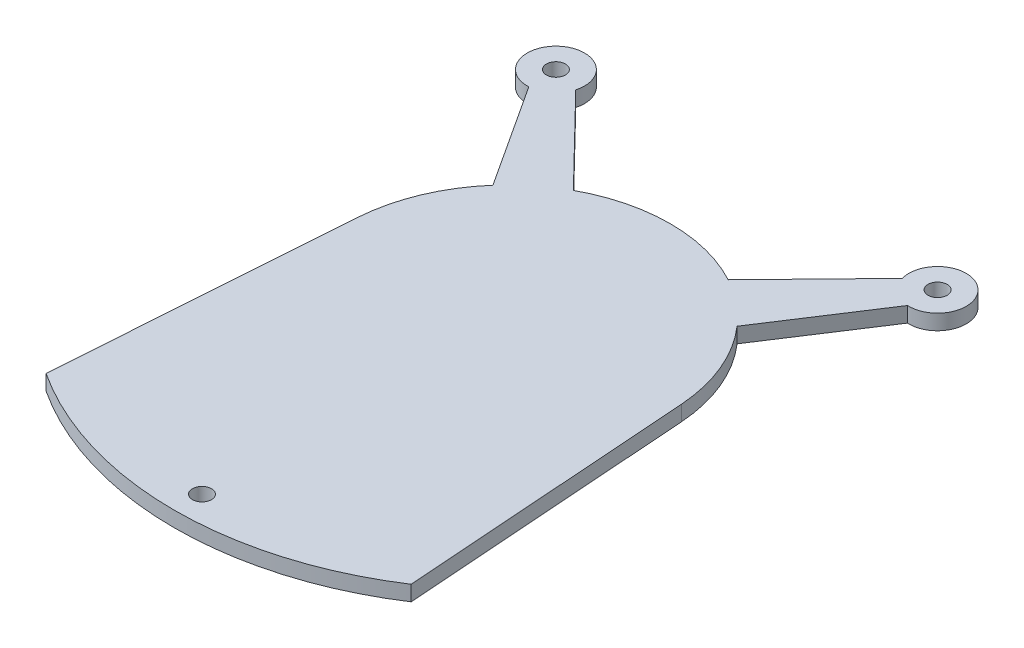
ISO-10303-21;
HEADER;
FILE_DESCRIPTION(('STEP AP214'),'2;1');
FILE_NAME('part.step','',(''),(''),'','','');
FILE_SCHEMA(('AUTOMOTIVE_DESIGN { 1 0 10303 214 1 1 1 1 }'));
ENDSEC;
DATA;
#1=APPLICATION_CONTEXT('core data for automotive mechanical design processes');
#2=APPLICATION_PROTOCOL_DEFINITION('international standard','automotive_design',2000,#1);
#3=PRODUCT_CONTEXT('',#1,'mechanical');
#4=PRODUCT('Part','Part','',(#3));
#5=PRODUCT_RELATED_PRODUCT_CATEGORY('part','',(#4));
#6=PRODUCT_DEFINITION_FORMATION('','',#4);
#7=PRODUCT_DEFINITION_CONTEXT('part definition',#1,'design');
#8=PRODUCT_DEFINITION('design','',#6,#7);
#9=PRODUCT_DEFINITION_SHAPE('','',#8);
#10=(LENGTH_UNIT() NAMED_UNIT(*) SI_UNIT(.MILLI.,.METRE.));
#11=(NAMED_UNIT(*) PLANE_ANGLE_UNIT() SI_UNIT($,.RADIAN.));
#12=(NAMED_UNIT(*) SI_UNIT($,.STERADIAN.) SOLID_ANGLE_UNIT());
#13=UNCERTAINTY_MEASURE_WITH_UNIT(LENGTH_MEASURE(1.E-05),#10,'distance_accuracy_value','');
#14=(GEOMETRIC_REPRESENTATION_CONTEXT(3) GLOBAL_UNCERTAINTY_ASSIGNED_CONTEXT((#13)) GLOBAL_UNIT_ASSIGNED_CONTEXT((#10,
#11,#12)) REPRESENTATION_CONTEXT('',''));
#15=CARTESIAN_POINT('',(0.,0.,0.));
#16=DIRECTION('',(0.,0.,1.));
#17=DIRECTION('',(1.,0.,0.));
#18=AXIS2_PLACEMENT_3D('',#15,#16,#17);
#19=CARTESIAN_POINT('',(-28.9,47.2,0.));
#20=DIRECTION('',(0.,1.,0.));
#21=DIRECTION('',(0.,0.,1.));
#22=AXIS2_PLACEMENT_3D('',#19,#20,#21);
#23=PLANE('',#22);
#24=CARTESIAN_POINT('',(2.6645352591E-13,47.2,32.09321722645));
#25=DIRECTION('',(0.,1.,0.));
#26=DIRECTION('',(0.,0.,1.));
#27=AXIS2_PLACEMENT_3D('',#24,#25,#26);
#28=CIRCLE('',#27,1.);
#29=CARTESIAN_POINT('',(2.6645352591E-13,47.2,33.09321722645));
#30=VERTEX_POINT('',#29);
#31=EDGE_CURVE('E172',#30,#30,#28,.F.);
#32=ORIENTED_EDGE('',*,*,#31,.T.);
#33=EDGE_LOOP('',(#32));
#34=FACE_BOUND('',#33,.T.);
#35=CARTESIAN_POINT('',(20.,47.2,-25.));
#36=DIRECTION('',(0.,1.,0.));
#37=DIRECTION('',(0.,0.,1.));
#38=AXIS2_PLACEMENT_3D('',#35,#36,#37);
#39=CIRCLE('',#38,1.);
#40=CARTESIAN_POINT('',(20.,47.2,-24.));
#41=VERTEX_POINT('',#40);
#42=EDGE_CURVE('E175',#41,#41,#39,.F.);
#43=ORIENTED_EDGE('',*,*,#42,.T.);
#44=EDGE_LOOP('',(#43));
#45=FACE_BOUND('',#44,.T.);
#46=CARTESIAN_POINT('',(-20.,47.2,-25.));
#47=DIRECTION('',(0.,1.,0.));
#48=DIRECTION('',(0.,0.,1.));
#49=AXIS2_PLACEMENT_3D('',#46,#47,#48);
#50=CIRCLE('',#49,1.);
#51=CARTESIAN_POINT('',(-20.,47.2,-24.));
#52=VERTEX_POINT('',#51);
#53=EDGE_CURVE('E178',#52,#52,#50,.F.);
#54=ORIENTED_EDGE('',*,*,#53,.T.);
#55=EDGE_LOOP('',(#54));
#56=FACE_BOUND('',#55,.T.);
#57=DIRECTION('',(-0.0711911611478,0.,0.997462690317));
#58=VECTOR('',#57,1.);
#59=CARTESIAN_POINT('',(-16.95686573539,47.2,-1.210249739513));
#60=LINE('',#59,#58);
#61=CARTESIAN_POINT('',(-19.1348964547178,47.2,29.3062405925299));
#62=VERTEX_POINT('',#61);
#63=CARTESIAN_POINT('',(-16.9568657353902,47.2,-1.21024973951075));
#64=VERTEX_POINT('',#63);
#65=EDGE_CURVE('E116',#62,#64,#60,.F.);
#66=ORIENTED_EDGE('',*,*,#65,.F.);
#67=CARTESIAN_POINT('',(2.6645352591E-13,47.2,2.060573933704E-13));
#68=DIRECTION('',(0.,1.,0.));
#69=DIRECTION('',(0.,0.,1.));
#70=AXIS2_PLACEMENT_3D('',#67,#68,#69);
#71=CIRCLE('',#70,35.);
#72=CARTESIAN_POINT('',(19.1348964547199,47.2,29.3062405925293));
#73=VERTEX_POINT('',#72);
#74=EDGE_CURVE('E19',#73,#62,#71,.F.);
#75=ORIENTED_EDGE('',*,*,#74,.F.);
#76=DIRECTION('',(-0.0711911611478,0.,-0.997462690317));
#77=VECTOR('',#76,1.);
#78=CARTESIAN_POINT('',(19.13489645472,47.2,29.30624059253));
#79=LINE('',#78,#77);
#80=CARTESIAN_POINT('',(16.9568657353907,47.2,-1.21024973951327));
#81=VERTEX_POINT('',#80);
#82=EDGE_CURVE('E102',#81,#73,#79,.F.);
#83=ORIENTED_EDGE('',*,*,#82,.F.);
#84=CARTESIAN_POINT('',(2.6645352591E-13,47.2,2.060573933704E-13));
#85=DIRECTION('',(0.,1.,0.));
#86=DIRECTION('',(0.,0.,1.));
#87=AXIS2_PLACEMENT_3D('',#84,#85,#86);
#88=CIRCLE('',#87,17.);
#89=CARTESIAN_POINT('',(12.7957539295805,47.2,-11.1923492339007));
#90=VERTEX_POINT('',#89);
#91=EDGE_CURVE('E123',#90,#81,#88,.F.);
#92=ORIENTED_EDGE('',*,*,#91,.F.);
#93=DIRECTION('',(0.546130195540326,0.,-0.83770031008654));
#94=VECTOR('',#93,1.);
#95=CARTESIAN_POINT('',(12.79575392958,47.2,-11.1923492339));
#96=LINE('',#95,#94);
#97=CARTESIAN_POINT('',(19.8443268773409,47.2,-22.0040417428006));
#98=VERTEX_POINT('',#97);
#99=EDGE_CURVE('E142',#98,#90,#96,.F.);
#100=ORIENTED_EDGE('',*,*,#99,.F.);
#101=CARTESIAN_POINT('',(20.,47.2,-25.));
#102=DIRECTION('',(0.,1.,0.));
#103=DIRECTION('',(0.,0.,1.));
#104=AXIS2_PLACEMENT_3D('',#101,#102,#103);
#105=CIRCLE('',#104,3.);
#106=CARTESIAN_POINT('',(17.1112860442906,47.2,-24.1904744092406));
#107=VERTEX_POINT('',#106);
#108=EDGE_CURVE('E188',#107,#98,#105,.F.);
#109=ORIENTED_EDGE('',*,*,#108,.F.);
#110=DIRECTION('',(-0.697386357160894,0.,0.716695380790094));
#111=VECTOR('',#110,1.);
#112=CARTESIAN_POINT('',(17.11128604429,47.2,-24.19047440924));
#113=LINE('',#112,#111);
#114=CARTESIAN_POINT('',(8.11054107292263,47.2,-14.940519519228));
#115=VERTEX_POINT('',#114);
#116=EDGE_CURVE('E138',#115,#107,#113,.F.);
#117=ORIENTED_EDGE('',*,*,#116,.F.);
#118=CARTESIAN_POINT('',(2.6645352591E-13,47.2,2.060573933704E-13));
#119=DIRECTION('',(0.,1.,0.));
#120=DIRECTION('',(0.,0.,1.));
#121=AXIS2_PLACEMENT_3D('',#118,#119,#120);
#122=CIRCLE('',#121,17.);
#123=CARTESIAN_POINT('',(-8.11054107292197,47.2,-14.9405195192289));
#124=VERTEX_POINT('',#123);
#125=EDGE_CURVE('E186',#124,#115,#122,.F.);
#126=ORIENTED_EDGE('',*,*,#125,.F.);
#127=DIRECTION('',(-0.697386357160894,0.,-0.716695380790094));
#128=VECTOR('',#127,1.);
#129=CARTESIAN_POINT('',(-8.110541072923,47.2,-14.94051951923));
#130=LINE('',#129,#128);
#131=CARTESIAN_POINT('',(-17.1112860442911,47.2,-24.1904744092418));
#132=VERTEX_POINT('',#131);
#133=EDGE_CURVE('E134',#132,#124,#130,.F.);
#134=ORIENTED_EDGE('',*,*,#133,.F.);
#135=CARTESIAN_POINT('',(-20.,47.2,-25.));
#136=DIRECTION('',(0.,1.,0.));
#137=DIRECTION('',(0.,0.,1.));
#138=AXIS2_PLACEMENT_3D('',#135,#136,#137);
#139=CIRCLE('',#138,3.);
#140=CARTESIAN_POINT('',(-19.8443268773402,47.2,-22.0040417428003));
#141=VERTEX_POINT('',#140);
#142=EDGE_CURVE('E184',#141,#132,#139,.F.);
#143=ORIENTED_EDGE('',*,*,#142,.F.);
#144=DIRECTION('',(0.546130195540326,0.,0.83770031008654));
#145=VECTOR('',#144,1.);
#146=CARTESIAN_POINT('',(-19.84432687734,47.2,-22.0040417428));
#147=LINE('',#146,#145);
#148=CARTESIAN_POINT('',(-12.7957539295804,47.2,-11.1923492339015));
#149=VERTEX_POINT('',#148);
#150=EDGE_CURVE('E130',#149,#141,#147,.F.);
#151=ORIENTED_EDGE('',*,*,#150,.F.);
#152=CARTESIAN_POINT('',(2.6645352591E-13,47.2,2.060573933704E-13));
#153=DIRECTION('',(0.,1.,0.));
#154=DIRECTION('',(0.,0.,1.));
#155=AXIS2_PLACEMENT_3D('',#152,#153,#154);
#156=CIRCLE('',#155,17.);
#157=EDGE_CURVE('E181',#64,#149,#156,.F.);
#158=ORIENTED_EDGE('',*,*,#157,.F.);
#159=EDGE_LOOP('',(#66,#75,#83,#92,#100,#109,#117,#126,#134,#143,#151,#158));
#160=FACE_BOUND('',#159,.T.);
#161=ADVANCED_FACE('F15',(#34,#45,#56,#160),#23,.T.);
#162=CARTESIAN_POINT('',(2.6645352591E-13,45.6,2.060573933704E-13));
#163=DIRECTION('',(0.,1.,0.));
#164=DIRECTION('',(0.,0.,1.));
#165=AXIS2_PLACEMENT_3D('',#162,#163,#164);
#166=CYLINDRICAL_SURFACE('',#165,35.);
#167=DIRECTION('',(0.,1.,0.));
#168=VECTOR('',#167,1.);
#169=CARTESIAN_POINT('',(-19.1348964547178,45.6,29.3062405925302));
#170=LINE('',#169,#168);
#171=CARTESIAN_POINT('',(-19.1348964547188,45.6,29.3062405925292));
#172=VERTEX_POINT('',#171);
#173=EDGE_CURVE('E129',#172,#62,#170,.T.);
#174=ORIENTED_EDGE('',*,*,#173,.F.);
#175=CARTESIAN_POINT('',(2.6645352591E-13,45.6,2.060573933704E-13));
#176=DIRECTION('',(0.,1.,0.));
#177=DIRECTION('',(0.,0.,1.));
#178=AXIS2_PLACEMENT_3D('',#175,#176,#177);
#179=CIRCLE('',#178,35.);
#180=CARTESIAN_POINT('',(19.1348964547199,45.6,29.3062405925293));
#181=VERTEX_POINT('',#180);
#182=EDGE_CURVE('E122',#172,#181,#179,.T.);
#183=ORIENTED_EDGE('',*,*,#182,.T.);
#184=DIRECTION('',(0.,1.,0.));
#185=VECTOR('',#184,1.);
#186=CARTESIAN_POINT('',(19.13489645472,45.6,29.30624059253));
#187=LINE('',#186,#185);
#188=EDGE_CURVE('E107',#73,#181,#187,.F.);
#189=ORIENTED_EDGE('',*,*,#188,.F.);
#190=ORIENTED_EDGE('',*,*,#74,.T.);
#191=EDGE_LOOP('',(#174,#183,#189,#190));
#192=FACE_BOUND('',#191,.T.);
#193=ADVANCED_FACE('F121',(#192),#166,.T.);
#194=CARTESIAN_POINT('',(19.13489645472,45.6,29.30624059253));
#195=DIRECTION('',(0.997462690317,0.,-0.0711911611478));
#196=DIRECTION('',(-0.0711911611478,0.,-0.997462690317));
#197=AXIS2_PLACEMENT_3D('',#194,#195,#196);
#198=PLANE('',#197);
#199=ORIENTED_EDGE('',*,*,#188,.T.);
#200=DIRECTION('',(-0.0711911611478701,0.,-0.997462690316995));
#201=VECTOR('',#200,1.);
#202=CARTESIAN_POINT('',(19.13489645472,45.6,29.30624059253));
#203=LINE('',#202,#201);
#204=CARTESIAN_POINT('',(16.9568657353896,45.6,-1.21024973951379));
#205=VERTEX_POINT('',#204);
#206=EDGE_CURVE('E170',#181,#205,#203,.T.);
#207=ORIENTED_EDGE('',*,*,#206,.T.);
#208=DIRECTION('',(0.,1.,0.));
#209=VECTOR('',#208,1.);
#210=CARTESIAN_POINT('',(16.9568657353892,45.6,-1.21024973951394));
#211=LINE('',#210,#209);
#212=EDGE_CURVE('E109',#81,#205,#211,.F.);
#213=ORIENTED_EDGE('',*,*,#212,.F.);
#214=ORIENTED_EDGE('',*,*,#82,.T.);
#215=EDGE_LOOP('',(#199,#207,#213,#214));
#216=FACE_BOUND('',#215,.T.);
#217=ADVANCED_FACE('F104',(#216),#198,.T.);
#218=CARTESIAN_POINT('',(2.6645352591E-13,45.6,2.060573933704E-13));
#219=DIRECTION('',(0.,1.,0.));
#220=DIRECTION('',(0.,0.,1.));
#221=AXIS2_PLACEMENT_3D('',#218,#219,#220);
#222=CYLINDRICAL_SURFACE('',#221,17.);
#223=ORIENTED_EDGE('',*,*,#212,.T.);
#224=CARTESIAN_POINT('',(2.6645352591E-13,45.6,2.060573933704E-13));
#225=DIRECTION('',(0.,1.,0.));
#226=DIRECTION('',(0.,0.,1.));
#227=AXIS2_PLACEMENT_3D('',#224,#225,#226);
#228=CIRCLE('',#227,17.);
#229=CARTESIAN_POINT('',(12.7957539295805,45.6,-11.1923492339007));
#230=VERTEX_POINT('',#229);
#231=EDGE_CURVE('E167',#205,#230,#228,.T.);
#232=ORIENTED_EDGE('',*,*,#231,.T.);
#233=DIRECTION('',(0.,1.,0.));
#234=VECTOR('',#233,1.);
#235=CARTESIAN_POINT('',(12.79575392958,45.6,-11.1923492339));
#236=LINE('',#235,#234);
#237=EDGE_CURVE('E143',#90,#230,#236,.F.);
#238=ORIENTED_EDGE('',*,*,#237,.F.);
#239=ORIENTED_EDGE('',*,*,#91,.T.);
#240=EDGE_LOOP('',(#223,#232,#238,#239));
#241=FACE_BOUND('',#240,.T.);
#242=ADVANCED_FACE('F251',(#241),#222,.T.);
#243=CARTESIAN_POINT('',(12.79575392958,45.6,-11.1923492339));
#244=DIRECTION('',(0.83770031008654,0.,0.546130195540326));
#245=DIRECTION('',(0.546130195540326,0.,-0.83770031008654));
#246=AXIS2_PLACEMENT_3D('',#243,#244,#245);
#247=PLANE('',#246);
#248=ORIENTED_EDGE('',*,*,#237,.T.);
#249=DIRECTION('',(0.546130195540243,0.,-0.837700310086595));
#250=VECTOR('',#249,1.);
#251=CARTESIAN_POINT('',(12.79575392958,45.6,-11.1923492339));
#252=LINE('',#251,#250);
#253=CARTESIAN_POINT('',(19.8443268773402,45.6,-22.0040417428006));
#254=VERTEX_POINT('',#253);
#255=EDGE_CURVE('E166',#230,#254,#252,.T.);
#256=ORIENTED_EDGE('',*,*,#255,.T.);
#257=DIRECTION('',(0.,1.,0.));
#258=VECTOR('',#257,1.);
#259=CARTESIAN_POINT('',(19.84432687734,45.6,-22.0040417428006));
#260=LINE('',#259,#258);
#261=EDGE_CURVE('E141',#98,#254,#260,.F.);
#262=ORIENTED_EDGE('',*,*,#261,.F.);
#263=ORIENTED_EDGE('',*,*,#99,.T.);
#264=EDGE_LOOP('',(#248,#256,#262,#263));
#265=FACE_BOUND('',#264,.T.);
#266=ADVANCED_FACE('F248',(#265),#247,.T.);
#267=CARTESIAN_POINT('',(20.,45.6,-25.));
#268=DIRECTION('',(0.,1.,0.));
#269=DIRECTION('',(0.,0.,1.));
#270=AXIS2_PLACEMENT_3D('',#267,#268,#269);
#271=CYLINDRICAL_SURFACE('',#270,3.);
#272=ORIENTED_EDGE('',*,*,#261,.T.);
#273=CARTESIAN_POINT('',(20.,45.6,-25.));
#274=DIRECTION('',(0.,1.,0.));
#275=DIRECTION('',(0.,0.,1.));
#276=AXIS2_PLACEMENT_3D('',#273,#274,#275);
#277=CIRCLE('',#276,3.);
#278=CARTESIAN_POINT('',(17.1112860442906,45.6,-24.1904744092406));
#279=VERTEX_POINT('',#278);
#280=EDGE_CURVE('E163',#254,#279,#277,.T.);
#281=ORIENTED_EDGE('',*,*,#280,.T.);
#282=DIRECTION('',(0.,1.,0.));
#283=VECTOR('',#282,1.);
#284=CARTESIAN_POINT('',(17.11128604429,45.6,-24.19047440924));
#285=LINE('',#284,#283);
#286=EDGE_CURVE('E140',#107,#279,#285,.F.);
#287=ORIENTED_EDGE('',*,*,#286,.F.);
#288=ORIENTED_EDGE('',*,*,#108,.T.);
#289=EDGE_LOOP('',(#272,#281,#287,#288));
#290=FACE_BOUND('',#289,.T.);
#291=ADVANCED_FACE('F246',(#290),#271,.T.);
#292=CARTESIAN_POINT('',(17.11128604429,45.6,-24.19047440924));
#293=DIRECTION('',(-0.716695380790094,0.,-0.697386357160894));
#294=DIRECTION('',(-0.697386357160894,0.,0.716695380790094));
#295=AXIS2_PLACEMENT_3D('',#292,#293,#294);
#296=PLANE('',#295);
#297=ORIENTED_EDGE('',*,*,#286,.T.);
#298=DIRECTION('',(-0.69738635716099,0.,0.716695380790001));
#299=VECTOR('',#298,1.);
#300=CARTESIAN_POINT('',(17.11128604429,45.6,-24.19047440924));
#301=LINE('',#300,#299);
#302=CARTESIAN_POINT('',(8.11054107292184,45.6,-14.9405195192284));
#303=VERTEX_POINT('',#302);
#304=EDGE_CURVE('E162',#279,#303,#301,.T.);
#305=ORIENTED_EDGE('',*,*,#304,.T.);
#306=DIRECTION('',(0.,1.,0.));
#307=VECTOR('',#306,1.);
#308=CARTESIAN_POINT('',(8.11054107292208,45.6,-14.9405195192283));
#309=LINE('',#308,#307);
#310=EDGE_CURVE('E137',#115,#303,#309,.F.);
#311=ORIENTED_EDGE('',*,*,#310,.F.);
#312=ORIENTED_EDGE('',*,*,#116,.T.);
#313=EDGE_LOOP('',(#297,#305,#311,#312));
#314=FACE_BOUND('',#313,.T.);
#315=ADVANCED_FACE('F244',(#314),#296,.T.);
#316=CARTESIAN_POINT('',(2.6645352591E-13,45.6,2.060573933704E-13));
#317=DIRECTION('',(0.,1.,0.));
#318=DIRECTION('',(0.,0.,1.));
#319=AXIS2_PLACEMENT_3D('',#316,#317,#318);
#320=CYLINDRICAL_SURFACE('',#319,17.);
#321=ORIENTED_EDGE('',*,*,#310,.T.);
#322=CARTESIAN_POINT('',(2.6645352591E-13,45.6,2.060573933704E-13));
#323=DIRECTION('',(0.,1.,0.));
#324=DIRECTION('',(0.,0.,1.));
#325=AXIS2_PLACEMENT_3D('',#322,#323,#324);
#326=CIRCLE('',#325,17.);
#327=CARTESIAN_POINT('',(-8.11054107292164,45.6,-14.9405195192291));
#328=VERTEX_POINT('',#327);
#329=EDGE_CURVE('E159',#303,#328,#326,.T.);
#330=ORIENTED_EDGE('',*,*,#329,.T.);
#331=DIRECTION('',(0.,1.,0.));
#332=VECTOR('',#331,1.);
#333=CARTESIAN_POINT('',(-8.11054107292251,45.6,-14.9405195192295));
#334=LINE('',#333,#332);
#335=EDGE_CURVE('E136',#124,#328,#334,.F.);
#336=ORIENTED_EDGE('',*,*,#335,.F.);
#337=ORIENTED_EDGE('',*,*,#125,.T.);
#338=EDGE_LOOP('',(#321,#330,#336,#337));
#339=FACE_BOUND('',#338,.T.);
#340=ADVANCED_FACE('F240',(#339),#320,.T.);
#341=CARTESIAN_POINT('',(-8.110541072923,45.6,-14.94051951923));
#342=DIRECTION('',(0.716695380790094,0.,-0.697386357160894));
#343=DIRECTION('',(-0.697386357160894,0.,-0.716695380790094));
#344=AXIS2_PLACEMENT_3D('',#341,#342,#343);
#345=PLANE('',#344);
#346=ORIENTED_EDGE('',*,*,#335,.T.);
#347=DIRECTION('',(-0.69738635716103,0.,-0.716695380789962));
#348=VECTOR('',#347,1.);
#349=CARTESIAN_POINT('',(-8.110541072922,45.6,-14.94051951923));
#350=LINE('',#349,#348);
#351=CARTESIAN_POINT('',(-17.1112860442913,45.6,-24.1904744092408));
#352=VERTEX_POINT('',#351);
#353=EDGE_CURVE('E158',#328,#352,#350,.T.);
#354=ORIENTED_EDGE('',*,*,#353,.T.);
#355=DIRECTION('',(0.,1.,0.));
#356=VECTOR('',#355,1.);
#357=CARTESIAN_POINT('',(-17.1112860442915,45.6,-24.1904744092404));
#358=LINE('',#357,#356);
#359=EDGE_CURVE('E133',#132,#352,#358,.F.);
#360=ORIENTED_EDGE('',*,*,#359,.F.);
#361=ORIENTED_EDGE('',*,*,#133,.T.);
#362=EDGE_LOOP('',(#346,#354,#360,#361));
#363=FACE_BOUND('',#362,.T.);
#364=ADVANCED_FACE('F234',(#363),#345,.T.);
#365=CARTESIAN_POINT('',(-20.,45.6,-25.));
#366=DIRECTION('',(0.,1.,0.));
#367=DIRECTION('',(0.,0.,1.));
#368=AXIS2_PLACEMENT_3D('',#365,#366,#367);
#369=CYLINDRICAL_SURFACE('',#368,3.);
#370=ORIENTED_EDGE('',*,*,#359,.T.);
#371=CARTESIAN_POINT('',(-20.,45.6,-25.));
#372=DIRECTION('',(0.,1.,0.));
#373=DIRECTION('',(0.,0.,1.));
#374=AXIS2_PLACEMENT_3D('',#371,#372,#373);
#375=CIRCLE('',#374,3.);
#376=CARTESIAN_POINT('',(-19.8443268773402,45.6,-22.0040417428003));
#377=VERTEX_POINT('',#376);
#378=EDGE_CURVE('E155',#352,#377,#375,.T.);
#379=ORIENTED_EDGE('',*,*,#378,.T.);
#380=DIRECTION('',(0.,1.,0.));
#381=VECTOR('',#380,1.);
#382=CARTESIAN_POINT('',(-19.84432687734,45.6,-22.0040417428));
#383=LINE('',#382,#381);
#384=EDGE_CURVE('E132',#141,#377,#383,.F.);
#385=ORIENTED_EDGE('',*,*,#384,.F.);
#386=ORIENTED_EDGE('',*,*,#142,.T.);
#387=EDGE_LOOP('',(#370,#379,#385,#386));
#388=FACE_BOUND('',#387,.T.);
#389=ADVANCED_FACE('F230',(#388),#369,.T.);
#390=CARTESIAN_POINT('',(-19.84432687734,45.6,-22.0040417428));
#391=DIRECTION('',(-0.83770031008654,0.,0.546130195540326));
#392=DIRECTION('',(0.546130195540326,0.,0.83770031008654));
#393=AXIS2_PLACEMENT_3D('',#390,#391,#392);
#394=PLANE('',#393);
#395=ORIENTED_EDGE('',*,*,#384,.T.);
#396=DIRECTION('',(0.546130195540243,0.,0.837700310086595));
#397=VECTOR('',#396,1.);
#398=CARTESIAN_POINT('',(-19.84432687734,45.6,-22.0040417428));
#399=LINE('',#398,#397);
#400=CARTESIAN_POINT('',(-12.7957539295809,45.6,-11.192349233901));
#401=VERTEX_POINT('',#400);
#402=EDGE_CURVE('E154',#377,#401,#399,.T.);
#403=ORIENTED_EDGE('',*,*,#402,.T.);
#404=DIRECTION('',(0.,1.,0.));
#405=VECTOR('',#404,1.);
#406=CARTESIAN_POINT('',(-12.795753929581,45.6,-11.1923492339009));
#407=LINE('',#406,#405);
#408=EDGE_CURVE('E183',#149,#401,#407,.F.);
#409=ORIENTED_EDGE('',*,*,#408,.F.);
#410=ORIENTED_EDGE('',*,*,#150,.T.);
#411=EDGE_LOOP('',(#395,#403,#409,#410));
#412=FACE_BOUND('',#411,.T.);
#413=ADVANCED_FACE('F224',(#412),#394,.T.);
#414=CARTESIAN_POINT('',(2.6645352591E-13,45.6,2.060573933704E-13));
#415=DIRECTION('',(0.,1.,0.));
#416=DIRECTION('',(0.,0.,1.));
#417=AXIS2_PLACEMENT_3D('',#414,#415,#416);
#418=CYLINDRICAL_SURFACE('',#417,17.);
#419=ORIENTED_EDGE('',*,*,#408,.T.);
#420=CARTESIAN_POINT('',(2.6645352591E-13,45.6,2.060573933704E-13));
#421=DIRECTION('',(0.,1.,0.));
#422=DIRECTION('',(0.,0.,1.));
#423=AXIS2_PLACEMENT_3D('',#420,#421,#422);
#424=CIRCLE('',#423,17.);
#425=CARTESIAN_POINT('',(-16.95686573539,45.6,-1.21024973951144));
#426=VERTEX_POINT('',#425);
#427=EDGE_CURVE('E151',#401,#426,#424,.T.);
#428=ORIENTED_EDGE('',*,*,#427,.T.);
#429=DIRECTION('',(0.,1.,0.));
#430=VECTOR('',#429,1.);
#431=CARTESIAN_POINT('',(-16.9568657353903,45.6,-1.21024973950902));
#432=LINE('',#431,#430);
#433=EDGE_CURVE('E34',#64,#426,#432,.F.);
#434=ORIENTED_EDGE('',*,*,#433,.F.);
#435=ORIENTED_EDGE('',*,*,#157,.T.);
#436=EDGE_LOOP('',(#419,#428,#434,#435));
#437=FACE_BOUND('',#436,.T.);
#438=ADVANCED_FACE('F220',(#437),#418,.T.);
#439=CARTESIAN_POINT('',(-16.95686573539,45.6,-1.210249739513));
#440=DIRECTION('',(-0.997462690317,0.,-0.0711911611478));
#441=DIRECTION('',(-0.0711911611478,0.,0.997462690317));
#442=AXIS2_PLACEMENT_3D('',#439,#440,#441);
#443=PLANE('',#442);
#444=ORIENTED_EDGE('',*,*,#433,.T.);
#445=DIRECTION('',(-0.0711911611478816,0.,0.997462690316994));
#446=VECTOR('',#445,1.);
#447=CARTESIAN_POINT('',(-16.95686573539,45.6,-1.210249739509));
#448=LINE('',#447,#446);
#449=EDGE_CURVE('E150',#426,#172,#448,.T.);
#450=ORIENTED_EDGE('',*,*,#449,.T.);
#451=ORIENTED_EDGE('',*,*,#173,.T.);
#452=ORIENTED_EDGE('',*,*,#65,.T.);
#453=EDGE_LOOP('',(#444,#450,#451,#452));
#454=FACE_BOUND('',#453,.T.);
#455=ADVANCED_FACE('F215',(#454),#443,.T.);
#456=CARTESIAN_POINT('',(-20.,45.6,-25.));
#457=DIRECTION('',(0.,1.,0.));
#458=DIRECTION('',(0.,0.,1.));
#459=AXIS2_PLACEMENT_3D('',#456,#457,#458);
#460=CYLINDRICAL_SURFACE('',#459,1.);
#461=ORIENTED_EDGE('',*,*,#53,.F.);
#462=EDGE_LOOP('',(#461));
#463=FACE_BOUND('',#462,.T.);
#464=CARTESIAN_POINT('',(-20.,45.6,-25.));
#465=DIRECTION('',(0.,1.,0.));
#466=DIRECTION('',(0.,0.,1.));
#467=AXIS2_PLACEMENT_3D('',#464,#465,#466);
#468=CIRCLE('',#467,1.);
#469=CARTESIAN_POINT('',(-20.,45.6,-24.));
#470=VERTEX_POINT('',#469);
#471=EDGE_CURVE('E147',#470,#470,#468,.F.);
#472=ORIENTED_EDGE('',*,*,#471,.T.);
#473=EDGE_LOOP('',(#472));
#474=FACE_BOUND('',#473,.T.);
#475=ADVANCED_FACE('F277',(#463,#474),#460,.F.);
#476=CARTESIAN_POINT('',(20.,45.6,-25.));
#477=DIRECTION('',(0.,1.,0.));
#478=DIRECTION('',(0.,0.,1.));
#479=AXIS2_PLACEMENT_3D('',#476,#477,#478);
#480=CYLINDRICAL_SURFACE('',#479,1.);
#481=ORIENTED_EDGE('',*,*,#42,.F.);
#482=EDGE_LOOP('',(#481));
#483=FACE_BOUND('',#482,.T.);
#484=CARTESIAN_POINT('',(20.,45.6,-25.));
#485=DIRECTION('',(0.,1.,0.));
#486=DIRECTION('',(0.,0.,1.));
#487=AXIS2_PLACEMENT_3D('',#484,#485,#486);
#488=CIRCLE('',#487,1.);
#489=CARTESIAN_POINT('',(20.,45.6,-24.));
#490=VERTEX_POINT('',#489);
#491=EDGE_CURVE('E25',#490,#490,#488,.F.);
#492=ORIENTED_EDGE('',*,*,#491,.T.);
#493=EDGE_LOOP('',(#492));
#494=FACE_BOUND('',#493,.T.);
#495=ADVANCED_FACE('F269',(#483,#494),#480,.F.);
#496=CARTESIAN_POINT('',(2.6645352591E-13,45.6,32.09321722645));
#497=DIRECTION('',(0.,1.,0.));
#498=DIRECTION('',(0.,0.,1.));
#499=AXIS2_PLACEMENT_3D('',#496,#497,#498);
#500=CYLINDRICAL_SURFACE('',#499,1.);
#501=ORIENTED_EDGE('',*,*,#31,.F.);
#502=EDGE_LOOP('',(#501));
#503=FACE_BOUND('',#502,.T.);
#504=CARTESIAN_POINT('',(2.6645352591E-13,45.6,32.09321722645));
#505=DIRECTION('',(0.,1.,0.));
#506=DIRECTION('',(0.,0.,1.));
#507=AXIS2_PLACEMENT_3D('',#504,#505,#506);
#508=CIRCLE('',#507,1.);
#509=CARTESIAN_POINT('',(2.6645352591E-13,45.6,33.09321722645));
#510=VERTEX_POINT('',#509);
#511=EDGE_CURVE('E10',#510,#510,#508,.F.);
#512=ORIENTED_EDGE('',*,*,#511,.T.);
#513=EDGE_LOOP('',(#512));
#514=FACE_BOUND('',#513,.T.);
#515=ADVANCED_FACE('F263',(#503,#514),#500,.F.);
#516=CARTESIAN_POINT('',(-28.9,45.6,0.));
#517=DIRECTION('',(0.,1.,0.));
#518=DIRECTION('',(0.,0.,1.));
#519=AXIS2_PLACEMENT_3D('',#516,#517,#518);
#520=PLANE('',#519);
#521=ORIENTED_EDGE('',*,*,#511,.F.);
#522=EDGE_LOOP('',(#521));
#523=FACE_BOUND('',#522,.T.);
#524=ORIENTED_EDGE('',*,*,#491,.F.);
#525=EDGE_LOOP('',(#524));
#526=FACE_BOUND('',#525,.T.);
#527=ORIENTED_EDGE('',*,*,#471,.F.);
#528=EDGE_LOOP('',(#527));
#529=FACE_BOUND('',#528,.T.);
#530=ORIENTED_EDGE('',*,*,#427,.F.);
#531=ORIENTED_EDGE('',*,*,#402,.F.);
#532=ORIENTED_EDGE('',*,*,#378,.F.);
#533=ORIENTED_EDGE('',*,*,#353,.F.);
#534=ORIENTED_EDGE('',*,*,#329,.F.);
#535=ORIENTED_EDGE('',*,*,#304,.F.);
#536=ORIENTED_EDGE('',*,*,#280,.F.);
#537=ORIENTED_EDGE('',*,*,#255,.F.);
#538=ORIENTED_EDGE('',*,*,#231,.F.);
#539=ORIENTED_EDGE('',*,*,#206,.F.);
#540=ORIENTED_EDGE('',*,*,#182,.F.);
#541=ORIENTED_EDGE('',*,*,#449,.F.);
#542=EDGE_LOOP('',(#530,#531,#532,#533,#534,#535,#536,#537,#538,#539,#540,#541));
#543=FACE_BOUND('',#542,.T.);
#544=ADVANCED_FACE('F17',(#523,#526,#529,#543),#520,.F.);
#545=CLOSED_SHELL('',(#161,#193,#217,#242,#266,#291,#315,#340,#364,#389,#413,#438,#455,#475,
#495,#515,#544));
#546=MANIFOLD_SOLID_BREP('B1',#545);
#547=ADVANCED_BREP_SHAPE_REPRESENTATION('',(#18,#546),#14);
#548=SHAPE_DEFINITION_REPRESENTATION(#9,#547);
ENDSEC;
END-ISO-10303-21;
